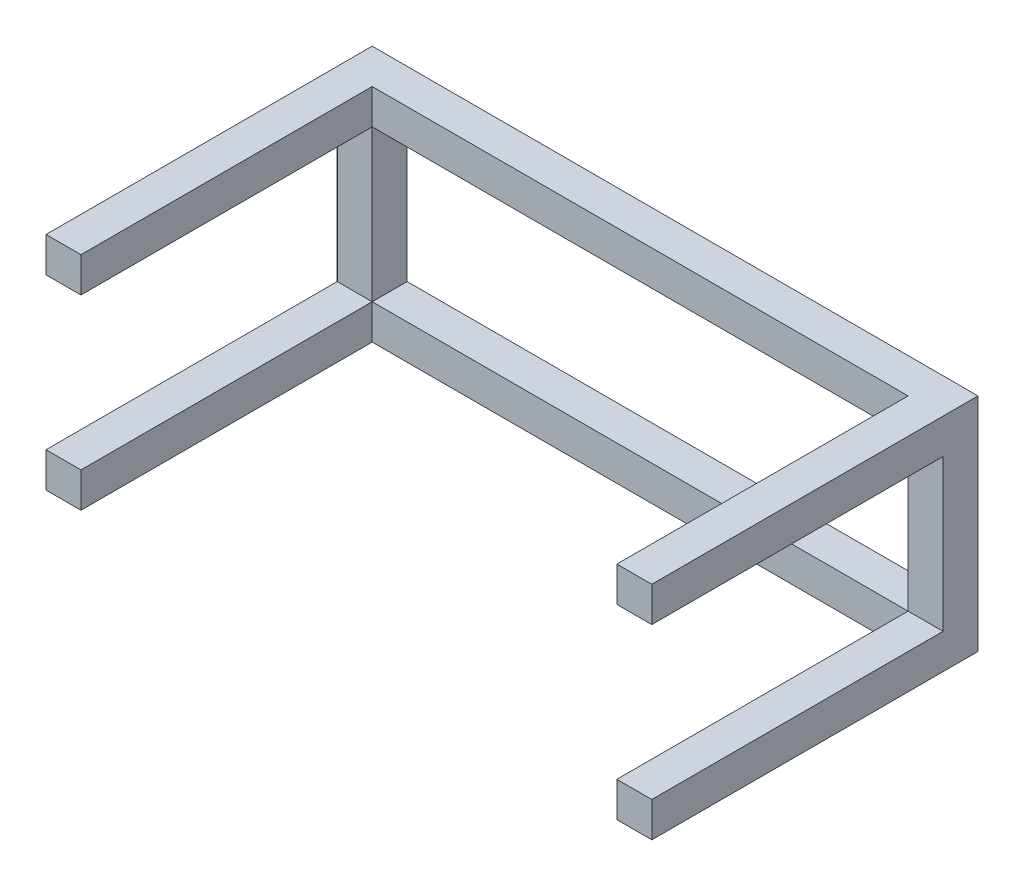
ISO-10303-21;
HEADER;
FILE_DESCRIPTION(('STEP AP214'),'2;1');
FILE_NAME('part.step','',(''),(''),'','','');
FILE_SCHEMA(('AUTOMOTIVE_DESIGN { 1 0 10303 214 1 1 1 1 }'));
ENDSEC;
DATA;
#1=APPLICATION_CONTEXT('core data for automotive mechanical design processes');
#2=APPLICATION_PROTOCOL_DEFINITION('international standard','automotive_design',2000,#1);
#3=PRODUCT_CONTEXT('',#1,'mechanical');
#4=PRODUCT('Part','Part','',(#3));
#5=PRODUCT_RELATED_PRODUCT_CATEGORY('part','',(#4));
#6=PRODUCT_DEFINITION_FORMATION('','',#4);
#7=PRODUCT_DEFINITION_CONTEXT('part definition',#1,'design');
#8=PRODUCT_DEFINITION('design','',#6,#7);
#9=PRODUCT_DEFINITION_SHAPE('','',#8);
#10=(LENGTH_UNIT() NAMED_UNIT(*) SI_UNIT(.MILLI.,.METRE.));
#11=(NAMED_UNIT(*) PLANE_ANGLE_UNIT() SI_UNIT($,.RADIAN.));
#12=(NAMED_UNIT(*) SI_UNIT($,.STERADIAN.) SOLID_ANGLE_UNIT());
#13=UNCERTAINTY_MEASURE_WITH_UNIT(LENGTH_MEASURE(1.E-05),#10,'distance_accuracy_value','');
#14=(GEOMETRIC_REPRESENTATION_CONTEXT(3) GLOBAL_UNCERTAINTY_ASSIGNED_CONTEXT((#13)) GLOBAL_UNIT_ASSIGNED_CONTEXT((#10,
#11,#12)) REPRESENTATION_CONTEXT('',''));
#15=CARTESIAN_POINT('',(0.,0.,0.));
#16=DIRECTION('',(0.,0.,1.));
#17=DIRECTION('',(1.,0.,0.));
#18=AXIS2_PLACEMENT_3D('',#15,#16,#17);
#19=CARTESIAN_POINT('',(0.,0.,30.));
#20=DIRECTION('',(0.,0.,1.));
#21=DIRECTION('',(1.,0.,0.));
#22=AXIS2_PLACEMENT_3D('',#19,#20,#21);
#23=PLANE('',#22);
#24=DIRECTION('',(0.,1.,0.));
#25=VECTOR('',#24,1.);
#26=CARTESIAN_POINT('',(30.,30.,30.));
#27=LINE('',#26,#25);
#28=CARTESIAN_POINT('',(30.,0.,30.));
#29=VERTEX_POINT('',#28);
#30=CARTESIAN_POINT('',(30.,30.,30.));
#31=VERTEX_POINT('',#30);
#32=EDGE_CURVE('E249',#29,#31,#27,.T.);
#33=ORIENTED_EDGE('',*,*,#32,.F.);
#34=DIRECTION('',(1.,0.,0.));
#35=VECTOR('',#34,1.);
#36=CARTESIAN_POINT('',(0.,0.,30.));
#37=LINE('',#36,#35);
#38=CARTESIAN_POINT('',(490.,0.,30.));
#39=VERTEX_POINT('',#38);
#40=EDGE_CURVE('E204',#29,#39,#37,.T.);
#41=ORIENTED_EDGE('',*,*,#40,.T.);
#42=DIRECTION('',(0.,-1.,0.));
#43=VECTOR('',#42,1.);
#44=CARTESIAN_POINT('',(490.,30.,30.));
#45=LINE('',#44,#43);
#46=CARTESIAN_POINT('',(490.,30.,30.));
#47=VERTEX_POINT('',#46);
#48=EDGE_CURVE('E202',#47,#39,#45,.T.);
#49=ORIENTED_EDGE('',*,*,#48,.F.);
#50=DIRECTION('',(1.,0.,0.));
#51=VECTOR('',#50,1.);
#52=CARTESIAN_POINT('',(0.,30.,30.));
#53=LINE('',#52,#51);
#54=EDGE_CURVE('E171',#31,#47,#53,.T.);
#55=ORIENTED_EDGE('',*,*,#54,.F.);
#56=EDGE_LOOP('',(#33,#41,#49,#55));
#57=FACE_BOUND('',#56,.T.);
#58=ADVANCED_FACE('F43',(#57),#23,.T.);
#59=DIRECTION('',(0.,-1.,0.));
#60=VECTOR('',#59,1.);
#61=CARTESIAN_POINT('',(490.,160.,30.));
#62=LINE('',#61,#60);
#63=CARTESIAN_POINT('',(490.,190.,30.));
#64=VERTEX_POINT('',#63);
#65=CARTESIAN_POINT('',(490.,160.,30.));
#66=VERTEX_POINT('',#65);
#67=EDGE_CURVE('E68',#64,#66,#62,.T.);
#68=ORIENTED_EDGE('',*,*,#67,.F.);
#69=DIRECTION('',(1.,0.,0.));
#70=VECTOR('',#69,1.);
#71=CARTESIAN_POINT('',(0.,190.,30.));
#72=LINE('',#71,#70);
#73=CARTESIAN_POINT('',(30.,190.,30.));
#74=VERTEX_POINT('',#73);
#75=EDGE_CURVE('E311',#74,#64,#72,.T.);
#76=ORIENTED_EDGE('',*,*,#75,.F.);
#77=DIRECTION('',(0.,1.,0.));
#78=VECTOR('',#77,1.);
#79=CARTESIAN_POINT('',(30.,190.,30.));
#80=LINE('',#79,#78);
#81=CARTESIAN_POINT('',(30.,160.,30.));
#82=VERTEX_POINT('',#81);
#83=EDGE_CURVE('E285',#82,#74,#80,.T.);
#84=ORIENTED_EDGE('',*,*,#83,.F.);
#85=DIRECTION('',(1.,0.,0.));
#86=VECTOR('',#85,1.);
#87=CARTESIAN_POINT('',(0.,160.,30.));
#88=LINE('',#87,#86);
#89=EDGE_CURVE('E199',#82,#66,#88,.T.);
#90=ORIENTED_EDGE('',*,*,#89,.T.);
#91=EDGE_LOOP('',(#68,#76,#84,#90));
#92=FACE_BOUND('',#91,.T.);
#93=ADVANCED_FACE('F353',(#92),#23,.T.);
#94=DIRECTION('',(-1.,0.,0.));
#95=VECTOR('',#94,1.);
#96=CARTESIAN_POINT('',(30.,30.,30.));
#97=LINE('',#96,#95);
#98=CARTESIAN_POINT('',(0.,30.,30.));
#99=VERTEX_POINT('',#98);
#100=EDGE_CURVE('E246',#31,#99,#97,.T.);
#101=ORIENTED_EDGE('',*,*,#100,.F.);
#102=DIRECTION('',(0.,1.,0.));
#103=VECTOR('',#102,1.);
#104=CARTESIAN_POINT('',(30.,0.,30.));
#105=LINE('',#104,#103);
#106=EDGE_CURVE('E182',#31,#82,#105,.T.);
#107=ORIENTED_EDGE('',*,*,#106,.T.);
#108=DIRECTION('',(1.,0.,0.));
#109=VECTOR('',#108,1.);
#110=CARTESIAN_POINT('',(0.,160.,30.));
#111=LINE('',#110,#109);
#112=CARTESIAN_POINT('',(0.,160.,30.));
#113=VERTEX_POINT('',#112);
#114=EDGE_CURVE('E60',#113,#82,#111,.T.);
#115=ORIENTED_EDGE('',*,*,#114,.F.);
#116=DIRECTION('',(0.,1.,0.));
#117=VECTOR('',#116,1.);
#118=CARTESIAN_POINT('',(0.,0.,30.));
#119=LINE('',#118,#117);
#120=EDGE_CURVE('E313',#99,#113,#119,.T.);
#121=ORIENTED_EDGE('',*,*,#120,.F.);
#122=EDGE_LOOP('',(#101,#107,#115,#121));
#123=FACE_BOUND('',#122,.T.);
#124=ADVANCED_FACE('F352',(#123),#23,.T.);
#125=CARTESIAN_POINT('',(0.,0.,30.));
#126=DIRECTION('',(0.,1.,0.));
#127=DIRECTION('',(0.,0.,1.));
#128=AXIS2_PLACEMENT_3D('',#125,#126,#127);
#129=PLANE('',#128);
#130=DIRECTION('',(1.,0.,0.));
#131=VECTOR('',#130,1.);
#132=CARTESIAN_POINT('',(0.,0.,0.));
#133=LINE('',#132,#131);
#134=CARTESIAN_POINT('',(0.,0.,0.));
#135=VERTEX_POINT('',#134);
#136=CARTESIAN_POINT('',(520.,0.,0.));
#137=VERTEX_POINT('',#136);
#138=EDGE_CURVE('E323',#135,#137,#133,.T.);
#139=ORIENTED_EDGE('',*,*,#138,.T.);
#140=DIRECTION('',(0.,0.,-1.));
#141=VECTOR('',#140,1.);
#142=CARTESIAN_POINT('',(520.,0.,30.));
#143=LINE('',#142,#141);
#144=CARTESIAN_POINT('',(520.,0.,280.));
#145=VERTEX_POINT('',#144);
#146=EDGE_CURVE('E11',#145,#137,#143,.T.);
#147=ORIENTED_EDGE('',*,*,#146,.F.);
#148=DIRECTION('',(1.,0.,0.));
#149=VECTOR('',#148,1.);
#150=CARTESIAN_POINT('',(490.,0.,280.));
#151=LINE('',#150,#149);
#152=CARTESIAN_POINT('',(490.,0.,280.));
#153=VERTEX_POINT('',#152);
#154=EDGE_CURVE('E233',#153,#145,#151,.T.);
#155=ORIENTED_EDGE('',*,*,#154,.F.);
#156=DIRECTION('',(0.,0.,-1.));
#157=VECTOR('',#156,1.);
#158=CARTESIAN_POINT('',(490.,0.,280.));
#159=LINE('',#158,#157);
#160=EDGE_CURVE('E228',#153,#39,#159,.T.);
#161=ORIENTED_EDGE('',*,*,#160,.T.);
#162=ORIENTED_EDGE('',*,*,#40,.F.);
#163=DIRECTION('',(0.,0.,-1.));
#164=VECTOR('',#163,1.);
#165=CARTESIAN_POINT('',(30.,0.,280.));
#166=LINE('',#165,#164);
#167=CARTESIAN_POINT('',(30.,0.,280.));
#168=VERTEX_POINT('',#167);
#169=EDGE_CURVE('E242',#168,#29,#166,.T.);
#170=ORIENTED_EDGE('',*,*,#169,.F.);
#171=DIRECTION('',(1.,0.,0.));
#172=VECTOR('',#171,1.);
#173=CARTESIAN_POINT('',(30.,0.,280.));
#174=LINE('',#173,#172);
#175=CARTESIAN_POINT('',(0.,0.,280.));
#176=VERTEX_POINT('',#175);
#177=EDGE_CURVE('E245',#176,#168,#174,.T.);
#178=ORIENTED_EDGE('',*,*,#177,.F.);
#179=DIRECTION('',(0.,0.,-1.));
#180=VECTOR('',#179,1.);
#181=CARTESIAN_POINT('',(0.,0.,30.));
#182=LINE('',#181,#180);
#183=EDGE_CURVE('E334',#176,#135,#182,.T.);
#184=ORIENTED_EDGE('',*,*,#183,.T.);
#185=EDGE_LOOP('',(#139,#147,#155,#161,#162,#170,#178,#184));
#186=FACE_BOUND('',#185,.T.);
#187=ADVANCED_FACE('F379',(#186),#129,.F.);
#188=CARTESIAN_POINT('',(520.,0.,30.));
#189=DIRECTION('',(1.,0.,0.));
#190=DIRECTION('',(0.,0.,-1.));
#191=AXIS2_PLACEMENT_3D('',#188,#189,#190);
#192=PLANE('',#191);
#193=DIRECTION('',(0.,-1.,0.));
#194=VECTOR('',#193,1.);
#195=CARTESIAN_POINT('',(520.,0.,0.));
#196=LINE('',#195,#194);
#197=CARTESIAN_POINT('',(520.,190.,0.));
#198=VERTEX_POINT('',#197);
#199=EDGE_CURVE('E326',#198,#137,#196,.T.);
#200=ORIENTED_EDGE('',*,*,#199,.F.);
#201=DIRECTION('',(0.,0.,-1.));
#202=VECTOR('',#201,1.);
#203=CARTESIAN_POINT('',(520.,190.,30.));
#204=LINE('',#203,#202);
#205=CARTESIAN_POINT('',(520.,190.,280.));
#206=VERTEX_POINT('',#205);
#207=EDGE_CURVE('E52',#206,#198,#204,.T.);
#208=ORIENTED_EDGE('',*,*,#207,.F.);
#209=DIRECTION('',(0.,1.,0.));
#210=VECTOR('',#209,1.);
#211=CARTESIAN_POINT('',(520.,160.,280.));
#212=LINE('',#211,#210);
#213=CARTESIAN_POINT('',(520.,160.,280.));
#214=VERTEX_POINT('',#213);
#215=EDGE_CURVE('E274',#214,#206,#212,.T.);
#216=ORIENTED_EDGE('',*,*,#215,.F.);
#217=DIRECTION('',(0.,0.,-1.));
#218=VECTOR('',#217,1.);
#219=CARTESIAN_POINT('',(520.,160.,280.));
#220=LINE('',#219,#218);
#221=CARTESIAN_POINT('',(520.,160.,30.));
#222=VERTEX_POINT('',#221);
#223=EDGE_CURVE('E263',#214,#222,#220,.T.);
#224=ORIENTED_EDGE('',*,*,#223,.T.);
#225=DIRECTION('',(0.,-1.,0.));
#226=VECTOR('',#225,1.);
#227=CARTESIAN_POINT('',(520.,0.,30.));
#228=LINE('',#227,#226);
#229=CARTESIAN_POINT('',(520.,30.,30.));
#230=VERTEX_POINT('',#229);
#231=EDGE_CURVE('E309',#222,#230,#228,.T.);
#232=ORIENTED_EDGE('',*,*,#231,.T.);
#233=DIRECTION('',(0.,0.,-1.));
#234=VECTOR('',#233,1.);
#235=CARTESIAN_POINT('',(520.,30.,280.));
#236=LINE('',#235,#234);
#237=CARTESIAN_POINT('',(520.,30.,280.));
#238=VERTEX_POINT('',#237);
#239=EDGE_CURVE('E219',#238,#230,#236,.T.);
#240=ORIENTED_EDGE('',*,*,#239,.F.);
#241=DIRECTION('',(0.,1.,0.));
#242=VECTOR('',#241,1.);
#243=CARTESIAN_POINT('',(520.,30.,280.));
#244=LINE('',#243,#242);
#245=EDGE_CURVE('E226',#145,#238,#244,.T.);
#246=ORIENTED_EDGE('',*,*,#245,.F.);
#247=ORIENTED_EDGE('',*,*,#146,.T.);
#248=EDGE_LOOP('',(#200,#208,#216,#224,#232,#240,#246,#247));
#249=FACE_BOUND('',#248,.T.);
#250=ADVANCED_FACE('F386',(#249),#192,.T.);
#251=CARTESIAN_POINT('',(0.,190.,30.));
#252=DIRECTION('',(0.,1.,0.));
#253=DIRECTION('',(0.,0.,1.));
#254=AXIS2_PLACEMENT_3D('',#251,#252,#253);
#255=PLANE('',#254);
#256=DIRECTION('',(1.,0.,0.));
#257=VECTOR('',#256,1.);
#258=CARTESIAN_POINT('',(0.,190.,0.));
#259=LINE('',#258,#257);
#260=CARTESIAN_POINT('',(0.,190.,0.));
#261=VERTEX_POINT('',#260);
#262=EDGE_CURVE('E329',#261,#198,#259,.T.);
#263=ORIENTED_EDGE('',*,*,#262,.F.);
#264=DIRECTION('',(0.,0.,-1.));
#265=VECTOR('',#264,1.);
#266=CARTESIAN_POINT('',(0.,190.,30.));
#267=LINE('',#266,#265);
#268=CARTESIAN_POINT('',(0.,190.,280.));
#269=VERTEX_POINT('',#268);
#270=EDGE_CURVE('E336',#269,#261,#267,.T.);
#271=ORIENTED_EDGE('',*,*,#270,.F.);
#272=DIRECTION('',(-1.,0.,0.));
#273=VECTOR('',#272,1.);
#274=CARTESIAN_POINT('',(0.,190.,280.));
#275=LINE('',#274,#273);
#276=CARTESIAN_POINT('',(30.,190.,280.));
#277=VERTEX_POINT('',#276);
#278=EDGE_CURVE('E289',#277,#269,#275,.T.);
#279=ORIENTED_EDGE('',*,*,#278,.F.);
#280=DIRECTION('',(0.,0.,-1.));
#281=VECTOR('',#280,1.);
#282=CARTESIAN_POINT('',(30.,190.,280.));
#283=LINE('',#282,#281);
#284=EDGE_CURVE('E292',#277,#74,#283,.T.);
#285=ORIENTED_EDGE('',*,*,#284,.T.);
#286=ORIENTED_EDGE('',*,*,#75,.T.);
#287=DIRECTION('',(0.,0.,-1.));
#288=VECTOR('',#287,1.);
#289=CARTESIAN_POINT('',(490.,190.,280.));
#290=LINE('',#289,#288);
#291=CARTESIAN_POINT('',(490.,190.,280.));
#292=VERTEX_POINT('',#291);
#293=EDGE_CURVE('E266',#292,#64,#290,.T.);
#294=ORIENTED_EDGE('',*,*,#293,.F.);
#295=DIRECTION('',(-1.,0.,0.));
#296=VECTOR('',#295,1.);
#297=CARTESIAN_POINT('',(490.,190.,280.));
#298=LINE('',#297,#296);
#299=EDGE_CURVE('E269',#206,#292,#298,.T.);
#300=ORIENTED_EDGE('',*,*,#299,.F.);
#301=ORIENTED_EDGE('',*,*,#207,.T.);
#302=EDGE_LOOP('',(#263,#271,#279,#285,#286,#294,#300,#301));
#303=FACE_BOUND('',#302,.T.);
#304=ADVANCED_FACE('F399',(#303),#255,.T.);
#305=CARTESIAN_POINT('',(0.,160.,30.));
#306=DIRECTION('',(0.,1.,0.));
#307=DIRECTION('',(0.,0.,1.));
#308=AXIS2_PLACEMENT_3D('',#305,#306,#307);
#309=PLANE('',#308);
#310=DIRECTION('',(1.,0.,0.));
#311=VECTOR('',#310,1.);
#312=CARTESIAN_POINT('',(0.,160.,0.));
#313=LINE('',#312,#311);
#314=CARTESIAN_POINT('',(30.,160.,0.));
#315=VERTEX_POINT('',#314);
#316=CARTESIAN_POINT('',(490.,160.,0.));
#317=VERTEX_POINT('',#316);
#318=EDGE_CURVE('E304',#315,#317,#313,.T.);
#319=ORIENTED_EDGE('',*,*,#318,.T.);
#320=DIRECTION('',(0.,0.,-1.));
#321=VECTOR('',#320,1.);
#322=CARTESIAN_POINT('',(490.,160.,30.));
#323=LINE('',#322,#321);
#324=EDGE_CURVE('E47',#66,#317,#323,.T.);
#325=ORIENTED_EDGE('',*,*,#324,.F.);
#326=ORIENTED_EDGE('',*,*,#89,.F.);
#327=DIRECTION('',(0.,0.,-1.));
#328=VECTOR('',#327,1.);
#329=CARTESIAN_POINT('',(30.,160.,30.));
#330=LINE('',#329,#328);
#331=EDGE_CURVE('E315',#82,#315,#330,.T.);
#332=ORIENTED_EDGE('',*,*,#331,.T.);
#333=EDGE_LOOP('',(#319,#325,#326,#332));
#334=FACE_BOUND('',#333,.T.);
#335=ADVANCED_FACE('F45',(#334),#309,.F.);
#336=CARTESIAN_POINT('',(490.,0.,30.));
#337=DIRECTION('',(1.,0.,0.));
#338=DIRECTION('',(0.,0.,-1.));
#339=AXIS2_PLACEMENT_3D('',#336,#337,#338);
#340=PLANE('',#339);
#341=DIRECTION('',(0.,-1.,0.));
#342=VECTOR('',#341,1.);
#343=CARTESIAN_POINT('',(490.,0.,0.));
#344=LINE('',#343,#342);
#345=CARTESIAN_POINT('',(490.,30.,0.));
#346=VERTEX_POINT('',#345);
#347=EDGE_CURVE('E190',#317,#346,#344,.T.);
#348=ORIENTED_EDGE('',*,*,#347,.T.);
#349=DIRECTION('',(0.,0.,-1.));
#350=VECTOR('',#349,1.);
#351=CARTESIAN_POINT('',(490.,30.,30.));
#352=LINE('',#351,#350);
#353=EDGE_CURVE('E175',#47,#346,#352,.T.);
#354=ORIENTED_EDGE('',*,*,#353,.F.);
#355=DIRECTION('',(0.,-1.,0.));
#356=VECTOR('',#355,1.);
#357=CARTESIAN_POINT('',(490.,0.,30.));
#358=LINE('',#357,#356);
#359=EDGE_CURVE('E183',#66,#47,#358,.T.);
#360=ORIENTED_EDGE('',*,*,#359,.F.);
#361=ORIENTED_EDGE('',*,*,#324,.T.);
#362=EDGE_LOOP('',(#348,#354,#360,#361));
#363=FACE_BOUND('',#362,.T.);
#364=ADVANCED_FACE('F188',(#363),#340,.F.);
#365=CARTESIAN_POINT('',(0.,30.,30.));
#366=DIRECTION('',(0.,1.,0.));
#367=DIRECTION('',(0.,0.,1.));
#368=AXIS2_PLACEMENT_3D('',#365,#366,#367);
#369=PLANE('',#368);
#370=DIRECTION('',(1.,0.,0.));
#371=VECTOR('',#370,1.);
#372=CARTESIAN_POINT('',(0.,30.,0.));
#373=LINE('',#372,#371);
#374=CARTESIAN_POINT('',(30.,30.,0.));
#375=VERTEX_POINT('',#374);
#376=EDGE_CURVE('E319',#375,#346,#373,.T.);
#377=ORIENTED_EDGE('',*,*,#376,.F.);
#378=DIRECTION('',(0.,0.,-1.));
#379=VECTOR('',#378,1.);
#380=CARTESIAN_POINT('',(30.,30.,30.));
#381=LINE('',#380,#379);
#382=EDGE_CURVE('E177',#31,#375,#381,.T.);
#383=ORIENTED_EDGE('',*,*,#382,.F.);
#384=ORIENTED_EDGE('',*,*,#54,.T.);
#385=ORIENTED_EDGE('',*,*,#353,.T.);
#386=EDGE_LOOP('',(#377,#383,#384,#385));
#387=FACE_BOUND('',#386,.T.);
#388=ADVANCED_FACE('F174',(#387),#369,.T.);
#389=CARTESIAN_POINT('',(30.,0.,30.));
#390=DIRECTION('',(-1.,0.,0.));
#391=DIRECTION('',(0.,0.,1.));
#392=AXIS2_PLACEMENT_3D('',#389,#390,#391);
#393=PLANE('',#392);
#394=DIRECTION('',(0.,1.,0.));
#395=VECTOR('',#394,1.);
#396=CARTESIAN_POINT('',(30.,0.,0.));
#397=LINE('',#396,#395);
#398=EDGE_CURVE('E321',#375,#315,#397,.T.);
#399=ORIENTED_EDGE('',*,*,#398,.T.);
#400=ORIENTED_EDGE('',*,*,#331,.F.);
#401=ORIENTED_EDGE('',*,*,#106,.F.);
#402=ORIENTED_EDGE('',*,*,#382,.T.);
#403=EDGE_LOOP('',(#399,#400,#401,#402));
#404=FACE_BOUND('',#403,.T.);
#405=ADVANCED_FACE('F343',(#404),#393,.F.);
#406=CARTESIAN_POINT('',(0.,0.,30.));
#407=DIRECTION('',(-1.,0.,0.));
#408=DIRECTION('',(0.,0.,1.));
#409=AXIS2_PLACEMENT_3D('',#406,#407,#408);
#410=PLANE('',#409);
#411=DIRECTION('',(0.,1.,0.));
#412=VECTOR('',#411,1.);
#413=CARTESIAN_POINT('',(0.,0.,0.));
#414=LINE('',#413,#412);
#415=EDGE_CURVE('E305',#135,#261,#414,.T.);
#416=ORIENTED_EDGE('',*,*,#415,.F.);
#417=ORIENTED_EDGE('',*,*,#183,.F.);
#418=DIRECTION('',(0.,-1.,0.));
#419=VECTOR('',#418,1.);
#420=CARTESIAN_POINT('',(0.,30.,280.));
#421=LINE('',#420,#419);
#422=CARTESIAN_POINT('',(0.,30.,280.));
#423=VERTEX_POINT('',#422);
#424=EDGE_CURVE('E254',#423,#176,#421,.T.);
#425=ORIENTED_EDGE('',*,*,#424,.F.);
#426=DIRECTION('',(0.,0.,-1.));
#427=VECTOR('',#426,1.);
#428=CARTESIAN_POINT('',(0.,30.,280.));
#429=LINE('',#428,#427);
#430=EDGE_CURVE('E239',#423,#99,#429,.T.);
#431=ORIENTED_EDGE('',*,*,#430,.T.);
#432=ORIENTED_EDGE('',*,*,#120,.T.);
#433=DIRECTION('',(0.,0.,-1.));
#434=VECTOR('',#433,1.);
#435=CARTESIAN_POINT('',(0.,160.,280.));
#436=LINE('',#435,#434);
#437=CARTESIAN_POINT('',(0.,160.,280.));
#438=VERTEX_POINT('',#437);
#439=EDGE_CURVE('E301',#438,#113,#436,.T.);
#440=ORIENTED_EDGE('',*,*,#439,.F.);
#441=DIRECTION('',(0.,-1.,0.));
#442=VECTOR('',#441,1.);
#443=CARTESIAN_POINT('',(0.,190.,280.));
#444=LINE('',#443,#442);
#445=EDGE_CURVE('E281',#269,#438,#444,.T.);
#446=ORIENTED_EDGE('',*,*,#445,.F.);
#447=ORIENTED_EDGE('',*,*,#270,.T.);
#448=EDGE_LOOP('',(#416,#417,#425,#431,#432,#440,#446,#447));
#449=FACE_BOUND('',#448,.T.);
#450=ADVANCED_FACE('F368',(#449),#410,.T.);
#451=DIRECTION('',(1.,0.,0.));
#452=VECTOR('',#451,1.);
#453=CARTESIAN_POINT('',(490.,160.,30.));
#454=LINE('',#453,#452);
#455=EDGE_CURVE('E198',#66,#222,#454,.T.);
#456=ORIENTED_EDGE('',*,*,#455,.F.);
#457=ORIENTED_EDGE('',*,*,#359,.T.);
#458=DIRECTION('',(-1.,0.,0.));
#459=VECTOR('',#458,1.);
#460=CARTESIAN_POINT('',(490.,30.,30.));
#461=LINE('',#460,#459);
#462=EDGE_CURVE('E195',#230,#47,#461,.T.);
#463=ORIENTED_EDGE('',*,*,#462,.F.);
#464=ORIENTED_EDGE('',*,*,#231,.F.);
#465=EDGE_LOOP('',(#456,#457,#463,#464));
#466=FACE_BOUND('',#465,.T.);
#467=ADVANCED_FACE('F193',(#466),#23,.T.);
#468=CARTESIAN_POINT('',(0.,0.,0.));
#469=DIRECTION('',(0.,0.,1.));
#470=DIRECTION('',(1.,0.,0.));
#471=AXIS2_PLACEMENT_3D('',#468,#469,#470);
#472=PLANE('',#471);
#473=ORIENTED_EDGE('',*,*,#318,.F.);
#474=ORIENTED_EDGE('',*,*,#398,.F.);
#475=ORIENTED_EDGE('',*,*,#376,.T.);
#476=ORIENTED_EDGE('',*,*,#347,.F.);
#477=EDGE_LOOP('',(#473,#474,#475,#476));
#478=FACE_BOUND('',#477,.T.);
#479=ORIENTED_EDGE('',*,*,#138,.F.);
#480=ORIENTED_EDGE('',*,*,#415,.T.);
#481=ORIENTED_EDGE('',*,*,#262,.T.);
#482=ORIENTED_EDGE('',*,*,#199,.T.);
#483=EDGE_LOOP('',(#479,#480,#481,#482));
#484=FACE_BOUND('',#483,.T.);
#485=ADVANCED_FACE('F347',(#478,#484),#472,.F.);
#486=CARTESIAN_POINT('',(0.,160.,280.));
#487=DIRECTION('',(0.,1.,0.));
#488=DIRECTION('',(0.,0.,1.));
#489=AXIS2_PLACEMENT_3D('',#486,#487,#488);
#490=PLANE('',#489);
#491=ORIENTED_EDGE('',*,*,#114,.T.);
#492=DIRECTION('',(0.,0.,-1.));
#493=VECTOR('',#492,1.);
#494=CARTESIAN_POINT('',(30.,160.,280.));
#495=LINE('',#494,#493);
#496=CARTESIAN_POINT('',(30.,160.,280.));
#497=VERTEX_POINT('',#496);
#498=EDGE_CURVE('E298',#497,#82,#495,.T.);
#499=ORIENTED_EDGE('',*,*,#498,.F.);
#500=DIRECTION('',(1.,0.,0.));
#501=VECTOR('',#500,1.);
#502=CARTESIAN_POINT('',(0.,160.,280.));
#503=LINE('',#502,#501);
#504=EDGE_CURVE('E284',#438,#497,#503,.T.);
#505=ORIENTED_EDGE('',*,*,#504,.F.);
#506=ORIENTED_EDGE('',*,*,#439,.T.);
#507=EDGE_LOOP('',(#491,#499,#505,#506));
#508=FACE_BOUND('',#507,.T.);
#509=ADVANCED_FACE('F358',(#508),#490,.F.);
#510=CARTESIAN_POINT('',(30.,190.,280.));
#511=DIRECTION('',(-1.,0.,0.));
#512=DIRECTION('',(0.,-1.,0.));
#513=AXIS2_PLACEMENT_3D('',#510,#511,#512);
#514=PLANE('',#513);
#515=ORIENTED_EDGE('',*,*,#83,.T.);
#516=ORIENTED_EDGE('',*,*,#284,.F.);
#517=DIRECTION('',(0.,1.,0.));
#518=VECTOR('',#517,1.);
#519=CARTESIAN_POINT('',(30.,190.,280.));
#520=LINE('',#519,#518);
#521=EDGE_CURVE('E287',#497,#277,#520,.T.);
#522=ORIENTED_EDGE('',*,*,#521,.F.);
#523=ORIENTED_EDGE('',*,*,#498,.T.);
#524=EDGE_LOOP('',(#515,#516,#522,#523));
#525=FACE_BOUND('',#524,.T.);
#526=ADVANCED_FACE('F361',(#525),#514,.F.);
#527=CARTESIAN_POINT('',(0.,0.,280.));
#528=DIRECTION('',(0.,0.,1.));
#529=DIRECTION('',(1.,0.,0.));
#530=AXIS2_PLACEMENT_3D('',#527,#528,#529);
#531=PLANE('',#530);
#532=ORIENTED_EDGE('',*,*,#445,.T.);
#533=ORIENTED_EDGE('',*,*,#504,.T.);
#534=ORIENTED_EDGE('',*,*,#521,.T.);
#535=ORIENTED_EDGE('',*,*,#278,.T.);
#536=EDGE_LOOP('',(#532,#533,#534,#535));
#537=FACE_BOUND('',#536,.T.);
#538=ADVANCED_FACE('F364',(#537),#531,.T.);
#539=CARTESIAN_POINT('',(490.,30.,280.));
#540=DIRECTION('',(1.,0.,0.));
#541=DIRECTION('',(0.,0.,-1.));
#542=AXIS2_PLACEMENT_3D('',#539,#540,#541);
#543=PLANE('',#542);
#544=ORIENTED_EDGE('',*,*,#48,.T.);
#545=ORIENTED_EDGE('',*,*,#160,.F.);
#546=DIRECTION('',(0.,-1.,0.));
#547=VECTOR('',#546,1.);
#548=CARTESIAN_POINT('',(490.,30.,280.));
#549=LINE('',#548,#547);
#550=CARTESIAN_POINT('',(490.,30.,280.));
#551=VERTEX_POINT('',#550);
#552=EDGE_CURVE('E220',#551,#153,#549,.T.);
#553=ORIENTED_EDGE('',*,*,#552,.F.);
#554=DIRECTION('',(0.,0.,-1.));
#555=VECTOR('',#554,1.);
#556=CARTESIAN_POINT('',(490.,30.,280.));
#557=LINE('',#556,#555);
#558=EDGE_CURVE('E216',#551,#47,#557,.T.);
#559=ORIENTED_EDGE('',*,*,#558,.T.);
#560=EDGE_LOOP('',(#544,#545,#553,#559));
#561=FACE_BOUND('',#560,.T.);
#562=ADVANCED_FACE('F222',(#561),#543,.F.);
#563=CARTESIAN_POINT('',(490.,30.,280.));
#564=DIRECTION('',(0.,-1.,0.));
#565=DIRECTION('',(0.,0.,-1.));
#566=AXIS2_PLACEMENT_3D('',#563,#564,#565);
#567=PLANE('',#566);
#568=ORIENTED_EDGE('',*,*,#462,.T.);
#569=ORIENTED_EDGE('',*,*,#558,.F.);
#570=DIRECTION('',(-1.,0.,0.));
#571=VECTOR('',#570,1.);
#572=CARTESIAN_POINT('',(490.,30.,280.));
#573=LINE('',#572,#571);
#574=EDGE_CURVE('E224',#238,#551,#573,.T.);
#575=ORIENTED_EDGE('',*,*,#574,.F.);
#576=ORIENTED_EDGE('',*,*,#239,.T.);
#577=EDGE_LOOP('',(#568,#569,#575,#576));
#578=FACE_BOUND('',#577,.T.);
#579=ADVANCED_FACE('F214',(#578),#567,.F.);
#580=CARTESIAN_POINT('',(0.,0.,280.));
#581=DIRECTION('',(0.,0.,1.));
#582=DIRECTION('',(1.,0.,0.));
#583=AXIS2_PLACEMENT_3D('',#580,#581,#582);
#584=PLANE('',#583);
#585=ORIENTED_EDGE('',*,*,#552,.T.);
#586=ORIENTED_EDGE('',*,*,#154,.T.);
#587=ORIENTED_EDGE('',*,*,#245,.T.);
#588=ORIENTED_EDGE('',*,*,#574,.T.);
#589=EDGE_LOOP('',(#585,#586,#587,#588));
#590=FACE_BOUND('',#589,.T.);
#591=ADVANCED_FACE('F383',(#590),#584,.T.);
#592=CARTESIAN_POINT('',(490.,160.,280.));
#593=DIRECTION('',(1.,0.,0.));
#594=DIRECTION('',(0.,0.,-1.));
#595=AXIS2_PLACEMENT_3D('',#592,#593,#594);
#596=PLANE('',#595);
#597=ORIENTED_EDGE('',*,*,#67,.T.);
#598=DIRECTION('',(0.,0.,-1.));
#599=VECTOR('',#598,1.);
#600=CARTESIAN_POINT('',(490.,160.,280.));
#601=LINE('',#600,#599);
#602=CARTESIAN_POINT('',(490.,160.,280.));
#603=VERTEX_POINT('',#602);
#604=EDGE_CURVE('E209',#603,#66,#601,.T.);
#605=ORIENTED_EDGE('',*,*,#604,.F.);
#606=DIRECTION('',(0.,-1.,0.));
#607=VECTOR('',#606,1.);
#608=CARTESIAN_POINT('',(490.,160.,280.));
#609=LINE('',#608,#607);
#610=EDGE_CURVE('E271',#292,#603,#609,.T.);
#611=ORIENTED_EDGE('',*,*,#610,.F.);
#612=ORIENTED_EDGE('',*,*,#293,.T.);
#613=EDGE_LOOP('',(#597,#605,#611,#612));
#614=FACE_BOUND('',#613,.T.);
#615=ADVANCED_FACE('F394',(#614),#596,.F.);
#616=CARTESIAN_POINT('',(490.,160.,280.));
#617=DIRECTION('',(0.,1.,0.));
#618=DIRECTION('',(0.,0.,1.));
#619=AXIS2_PLACEMENT_3D('',#616,#617,#618);
#620=PLANE('',#619);
#621=ORIENTED_EDGE('',*,*,#455,.T.);
#622=ORIENTED_EDGE('',*,*,#223,.F.);
#623=DIRECTION('',(1.,0.,0.));
#624=VECTOR('',#623,1.);
#625=CARTESIAN_POINT('',(490.,160.,280.));
#626=LINE('',#625,#624);
#627=EDGE_CURVE('E277',#603,#214,#626,.T.);
#628=ORIENTED_EDGE('',*,*,#627,.F.);
#629=ORIENTED_EDGE('',*,*,#604,.T.);
#630=EDGE_LOOP('',(#621,#622,#628,#629));
#631=FACE_BOUND('',#630,.T.);
#632=ADVANCED_FACE('F390',(#631),#620,.F.);
#633=CARTESIAN_POINT('',(0.,0.,280.));
#634=DIRECTION('',(0.,0.,-1.));
#635=DIRECTION('',(-1.,0.,0.));
#636=AXIS2_PLACEMENT_3D('',#633,#634,#635);
#637=PLANE('',#636);
#638=ORIENTED_EDGE('',*,*,#610,.T.);
#639=ORIENTED_EDGE('',*,*,#627,.T.);
#640=ORIENTED_EDGE('',*,*,#215,.T.);
#641=ORIENTED_EDGE('',*,*,#299,.T.);
#642=EDGE_LOOP('',(#638,#639,#640,#641));
#643=FACE_BOUND('',#642,.T.);
#644=ADVANCED_FACE('F651',(#643),#637,.F.);
#645=CARTESIAN_POINT('',(30.,30.,280.));
#646=DIRECTION('',(-1.,0.,0.));
#647=DIRECTION('',(0.,0.,1.));
#648=AXIS2_PLACEMENT_3D('',#645,#646,#647);
#649=PLANE('',#648);
#650=ORIENTED_EDGE('',*,*,#32,.T.);
#651=DIRECTION('',(0.,0.,-1.));
#652=VECTOR('',#651,1.);
#653=CARTESIAN_POINT('',(30.,30.,280.));
#654=LINE('',#653,#652);
#655=CARTESIAN_POINT('',(30.,30.,280.));
#656=VERTEX_POINT('',#655);
#657=EDGE_CURVE('E237',#656,#31,#654,.T.);
#658=ORIENTED_EDGE('',*,*,#657,.F.);
#659=DIRECTION('',(0.,1.,0.));
#660=VECTOR('',#659,1.);
#661=CARTESIAN_POINT('',(30.,30.,280.));
#662=LINE('',#661,#660);
#663=EDGE_CURVE('E250',#168,#656,#662,.T.);
#664=ORIENTED_EDGE('',*,*,#663,.F.);
#665=ORIENTED_EDGE('',*,*,#169,.T.);
#666=EDGE_LOOP('',(#650,#658,#664,#665));
#667=FACE_BOUND('',#666,.T.);
#668=ADVANCED_FACE('F376',(#667),#649,.F.);
#669=CARTESIAN_POINT('',(30.,30.,280.));
#670=DIRECTION('',(0.,-1.,0.));
#671=DIRECTION('',(0.,0.,-1.));
#672=AXIS2_PLACEMENT_3D('',#669,#670,#671);
#673=PLANE('',#672);
#674=ORIENTED_EDGE('',*,*,#100,.T.);
#675=ORIENTED_EDGE('',*,*,#430,.F.);
#676=DIRECTION('',(-1.,0.,0.));
#677=VECTOR('',#676,1.);
#678=CARTESIAN_POINT('',(30.,30.,280.));
#679=LINE('',#678,#677);
#680=EDGE_CURVE('E257',#656,#423,#679,.T.);
#681=ORIENTED_EDGE('',*,*,#680,.F.);
#682=ORIENTED_EDGE('',*,*,#657,.T.);
#683=EDGE_LOOP('',(#674,#675,#681,#682));
#684=FACE_BOUND('',#683,.T.);
#685=ADVANCED_FACE('F372',(#684),#673,.F.);
#686=CARTESIAN_POINT('',(0.,0.,280.));
#687=DIRECTION('',(0.,0.,-1.));
#688=DIRECTION('',(-1.,0.,0.));
#689=AXIS2_PLACEMENT_3D('',#686,#687,#688);
#690=PLANE('',#689);
#691=ORIENTED_EDGE('',*,*,#663,.T.);
#692=ORIENTED_EDGE('',*,*,#680,.T.);
#693=ORIENTED_EDGE('',*,*,#424,.T.);
#694=ORIENTED_EDGE('',*,*,#177,.T.);
#695=EDGE_LOOP('',(#691,#692,#693,#694));
#696=FACE_BOUND('',#695,.T.);
#697=ADVANCED_FACE('F402',(#696),#690,.F.);
#698=CLOSED_SHELL('',(#58,#93,#124,#187,#250,#304,#335,#364,#388,#405,#450,#467,#485,#509,#526,
#538,#562,#579,#591,#615,#632,#644,#668,#685,#697));
#699=MANIFOLD_SOLID_BREP('B2',#698);
#700=ADVANCED_BREP_SHAPE_REPRESENTATION('',(#18,#699),#14);
#701=SHAPE_DEFINITION_REPRESENTATION(#9,#700);
ENDSEC;
END-ISO-10303-21;
